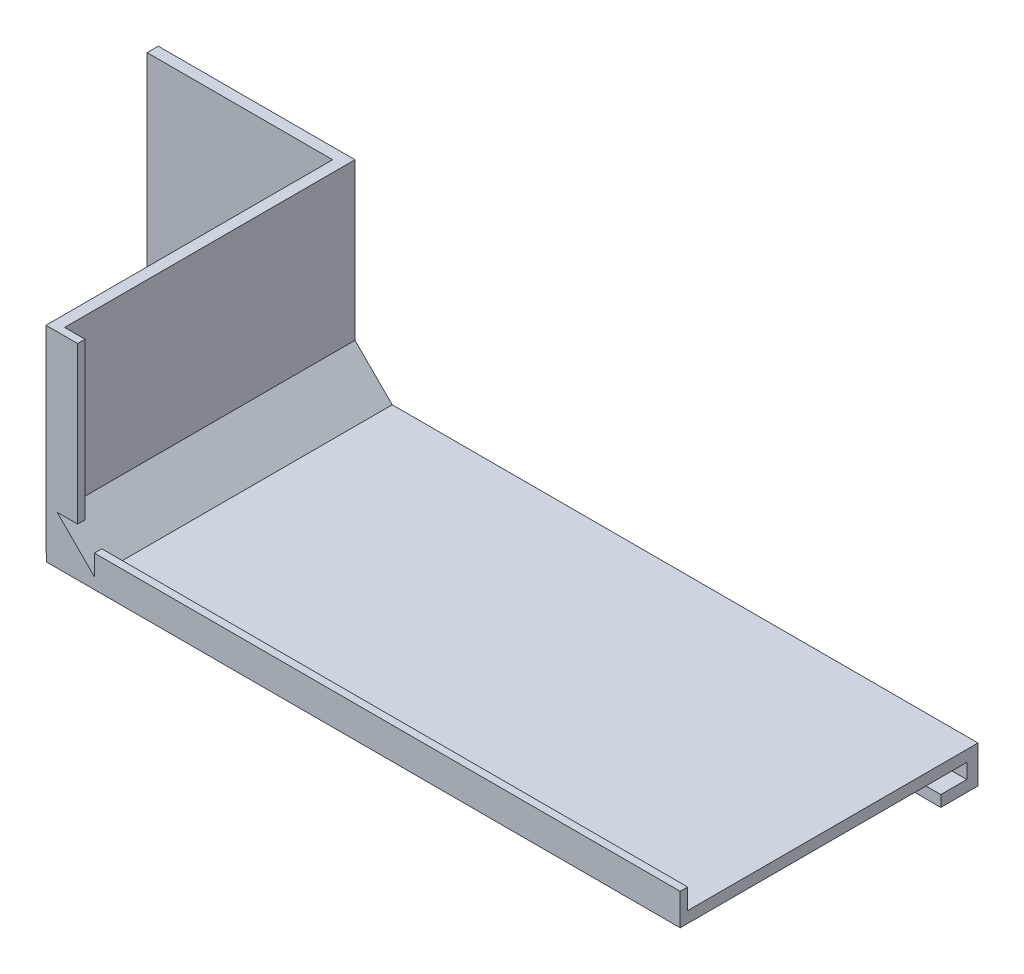
ISO-10303-21;
HEADER;
FILE_DESCRIPTION(('STEP AP214'),'2;1');
FILE_NAME('part.step','',(''),(''),'','','');
FILE_SCHEMA(('AUTOMOTIVE_DESIGN { 1 0 10303 214 1 1 1 1 }'));
ENDSEC;
DATA;
#1=APPLICATION_CONTEXT('core data for automotive mechanical design processes');
#2=APPLICATION_PROTOCOL_DEFINITION('international standard','automotive_design',2000,#1);
#3=PRODUCT_CONTEXT('',#1,'mechanical');
#4=PRODUCT('Part','Part','',(#3));
#5=PRODUCT_RELATED_PRODUCT_CATEGORY('part','',(#4));
#6=PRODUCT_DEFINITION_FORMATION('','',#4);
#7=PRODUCT_DEFINITION_CONTEXT('part definition',#1,'design');
#8=PRODUCT_DEFINITION('design','',#6,#7);
#9=PRODUCT_DEFINITION_SHAPE('','',#8);
#10=(LENGTH_UNIT() NAMED_UNIT(*) SI_UNIT(.MILLI.,.METRE.));
#11=(NAMED_UNIT(*) PLANE_ANGLE_UNIT() SI_UNIT($,.RADIAN.));
#12=(NAMED_UNIT(*) SI_UNIT($,.STERADIAN.) SOLID_ANGLE_UNIT());
#13=UNCERTAINTY_MEASURE_WITH_UNIT(LENGTH_MEASURE(1.E-05),#10,'distance_accuracy_value','');
#14=(GEOMETRIC_REPRESENTATION_CONTEXT(3) GLOBAL_UNCERTAINTY_ASSIGNED_CONTEXT((#13)) GLOBAL_UNIT_ASSIGNED_CONTEXT((#10,
#11,#12)) REPRESENTATION_CONTEXT('',''));
#15=CARTESIAN_POINT('',(0.,0.,0.));
#16=DIRECTION('',(0.,0.,1.));
#17=DIRECTION('',(1.,0.,0.));
#18=AXIS2_PLACEMENT_3D('',#15,#16,#17);
#19=CARTESIAN_POINT('',(0.,4.,0.));
#20=DIRECTION('',(0.,-1.,0.));
#21=DIRECTION('',(0.,0.,-1.));
#22=AXIS2_PLACEMENT_3D('',#19,#20,#21);
#23=PLANE('',#22);
#24=DIRECTION('',(-1.,0.,0.));
#25=VECTOR('',#24,1.);
#26=CARTESIAN_POINT('',(0.,4.,-53.));
#27=LINE('',#26,#25);
#28=CARTESIAN_POINT('',(220.183732216023,4.,-53.));
#29=VERTEX_POINT('',#28);
#30=CARTESIAN_POINT('',(62.8397431775084,4.,-53.));
#31=VERTEX_POINT('',#30);
#32=EDGE_CURVE('E64',#29,#31,#27,.T.);
#33=ORIENTED_EDGE('',*,*,#32,.F.);
#34=DIRECTION('',(0.,0.,1.));
#35=VECTOR('',#34,1.);
#36=CARTESIAN_POINT('',(220.183732216023,4.,-9.99999999999999));
#37=LINE('',#36,#35);
#38=CARTESIAN_POINT('',(220.183732216023,4.,-131.));
#39=VERTEX_POINT('',#38);
#40=EDGE_CURVE('E333',#39,#29,#37,.T.);
#41=ORIENTED_EDGE('',*,*,#40,.F.);
#42=DIRECTION('',(1.,0.,0.));
#43=VECTOR('',#42,1.);
#44=CARTESIAN_POINT('',(39.7994974842648,4.,-131.));
#45=LINE('',#44,#43);
#46=CARTESIAN_POINT('',(62.8397431775084,4.,-131.));
#47=VERTEX_POINT('',#46);
#48=EDGE_CURVE('E329',#47,#39,#45,.T.);
#49=ORIENTED_EDGE('',*,*,#48,.F.);
#50=DIRECTION('',(0.,0.,1.));
#51=VECTOR('',#50,1.);
#52=CARTESIAN_POINT('',(62.8397431775084,4.,-11.5));
#53=LINE('',#52,#51);
#54=EDGE_CURVE('E340',#47,#31,#53,.T.);
#55=ORIENTED_EDGE('',*,*,#54,.T.);
#56=EDGE_LOOP('',(#33,#41,#49,#55));
#57=FACE_BOUND('',#56,.T.);
#58=ADVANCED_FACE('F48',(#57),#23,.F.);
#59=CARTESIAN_POINT('',(52.8397431775085,341.294854205715,134.));
#60=DIRECTION('',(-1.,0.,0.));
#61=DIRECTION('',(0.,0.,1.));
#62=AXIS2_PLACEMENT_3D('',#59,#60,#61);
#63=PLANE('',#62);
#64=DIRECTION('',(0.,1.,0.));
#65=VECTOR('',#64,1.);
#66=CARTESIAN_POINT('',(52.8397431775085,341.294854205715,-53.));
#67=LINE('',#66,#65);
#68=CARTESIAN_POINT('',(52.8397431775085,14.0000000000001,-53.));
#69=VERTEX_POINT('',#68);
#70=CARTESIAN_POINT('',(52.8397431775085,56.,-53.));
#71=VERTEX_POINT('',#70);
#72=EDGE_CURVE('E257',#69,#71,#67,.T.);
#73=ORIENTED_EDGE('',*,*,#72,.F.);
#74=DIRECTION('',(0.,0.,-1.));
#75=VECTOR('',#74,1.);
#76=CARTESIAN_POINT('',(52.8397431775085,14.0000000000001,-131.));
#77=LINE('',#76,#75);
#78=CARTESIAN_POINT('',(52.8397431775085,14.0000000000001,-131.));
#79=VERTEX_POINT('',#78);
#80=EDGE_CURVE('E336',#69,#79,#77,.T.);
#81=ORIENTED_EDGE('',*,*,#80,.T.);
#82=DIRECTION('',(0.,-1.,0.));
#83=VECTOR('',#82,1.);
#84=CARTESIAN_POINT('',(52.8397431775085,341.294854205715,-131.));
#85=LINE('',#84,#83);
#86=CARTESIAN_POINT('',(52.8397431775085,56.,-131.));
#87=VERTEX_POINT('',#86);
#88=EDGE_CURVE('E323',#87,#79,#85,.T.);
#89=ORIENTED_EDGE('',*,*,#88,.F.);
#90=DIRECTION('',(0.,0.,1.));
#91=VECTOR('',#90,1.);
#92=CARTESIAN_POINT('',(52.8397431775085,56.,134.));
#93=LINE('',#92,#91);
#94=EDGE_CURVE('E312',#87,#71,#93,.T.);
#95=ORIENTED_EDGE('',*,*,#94,.T.);
#96=EDGE_LOOP('',(#73,#81,#89,#95));
#97=FACE_BOUND('',#96,.T.);
#98=ADVANCED_FACE('F364',(#97),#63,.F.);
#99=CARTESIAN_POINT('',(0.,0.,-131.));
#100=DIRECTION('',(0.,0.,1.));
#101=DIRECTION('',(1.,0.,0.));
#102=AXIS2_PLACEMENT_3D('',#99,#100,#101);
#103=CYLINDRICAL_SURFACE('',#102,50.);
#104=CARTESIAN_POINT('',(0.,0.,-128.));
#105=DIRECTION('',(0.,0.,-1.));
#106=DIRECTION('',(-1.,0.,0.));
#107=AXIS2_PLACEMENT_3D('',#104,#105,#106);
#108=CIRCLE('',#107,50.);
#109=CARTESIAN_POINT('',(49.6386945839634,-6.,-128.));
#110=VERTEX_POINT('',#109);
#111=CARTESIAN_POINT('',(49.9099188538711,-3.,-128.));
#112=VERTEX_POINT('',#111);
#113=EDGE_CURVE('E194',#110,#112,#108,.F.);
#114=ORIENTED_EDGE('',*,*,#113,.F.);
#115=DIRECTION('',(0.,0.,1.));
#116=VECTOR('',#115,1.);
#117=CARTESIAN_POINT('',(49.6386945839634,-6.,-131.));
#118=LINE('',#117,#116);
#119=CARTESIAN_POINT('',(49.6386945839634,-6.00000000000001,-121.));
#120=VERTEX_POINT('',#119);
#121=EDGE_CURVE('E188',#120,#110,#118,.F.);
#122=ORIENTED_EDGE('',*,*,#121,.F.);
#123=CARTESIAN_POINT('',(0.,0.,-121.));
#124=DIRECTION('',(0.,0.,-1.));
#125=DIRECTION('',(1.,0.,0.));
#126=AXIS2_PLACEMENT_3D('',#123,#124,#125);
#127=CIRCLE('',#126,50.);
#128=CARTESIAN_POINT('',(49.9099188538711,-3.,-121.));
#129=VERTEX_POINT('',#128);
#130=EDGE_CURVE('E193',#129,#120,#127,.T.);
#131=ORIENTED_EDGE('',*,*,#130,.F.);
#132=DIRECTION('',(0.,0.,1.));
#133=VECTOR('',#132,1.);
#134=CARTESIAN_POINT('',(49.9099188538711,-3.,-131.));
#135=LINE('',#134,#133);
#136=EDGE_CURVE('E279',#129,#112,#135,.F.);
#137=ORIENTED_EDGE('',*,*,#136,.T.);
#138=EDGE_LOOP('',(#114,#122,#131,#137));
#139=FACE_BOUND('',#138,.T.);
#140=ADVANCED_FACE('F190',(#139),#103,.F.);
#141=DIRECTION('',(0.,0.,1.));
#142=VECTOR('',#141,1.);
#143=CARTESIAN_POINT('',(49.9899989998,1.,-131.));
#144=LINE('',#143,#142);
#145=CARTESIAN_POINT('',(49.9899989998,1.,-128.));
#146=VERTEX_POINT('',#145);
#147=CARTESIAN_POINT('',(49.9899989998,1.,-51.));
#148=VERTEX_POINT('',#147);
#149=EDGE_CURVE('E292',#146,#148,#144,.T.);
#150=ORIENTED_EDGE('',*,*,#149,.T.);
#151=CARTESIAN_POINT('',(0.,0.,-51.));
#152=DIRECTION('',(0.,0.,-1.));
#153=DIRECTION('',(0.,1.,0.));
#154=AXIS2_PLACEMENT_3D('',#151,#152,#153);
#155=CIRCLE('',#154,50.);
#156=CARTESIAN_POINT('',(49.8397431775085,4.,-51.));
#157=VERTEX_POINT('',#156);
#158=EDGE_CURVE('E264',#148,#157,#155,.F.);
#159=ORIENTED_EDGE('',*,*,#158,.T.);
#160=DIRECTION('',(0.,0.,1.));
#161=VECTOR('',#160,1.);
#162=CARTESIAN_POINT('',(49.8397431775085,4.,131.));
#163=LINE('',#162,#161);
#164=CARTESIAN_POINT('',(49.8397431775085,4.,-128.));
#165=VERTEX_POINT('',#164);
#166=EDGE_CURVE('E309',#165,#157,#163,.T.);
#167=ORIENTED_EDGE('',*,*,#166,.F.);
#168=EDGE_CURVE('E307',#146,#165,#108,.F.);
#169=ORIENTED_EDGE('',*,*,#168,.F.);
#170=EDGE_LOOP('',(#150,#159,#167,#169));
#171=FACE_BOUND('',#170,.T.);
#172=ADVANCED_FACE('F399',(#171),#103,.F.);
#173=CARTESIAN_POINT('',(49.8397431775085,341.294854205715,131.));
#174=DIRECTION('',(1.,0.,0.));
#175=DIRECTION('',(0.,0.,-1.));
#176=AXIS2_PLACEMENT_3D('',#173,#174,#175);
#177=PLANE('',#176);
#178=ORIENTED_EDGE('',*,*,#166,.T.);
#179=DIRECTION('',(0.,1.,0.));
#180=VECTOR('',#179,1.);
#181=CARTESIAN_POINT('',(49.8397431775085,341.294854205715,-51.));
#182=LINE('',#181,#180);
#183=CARTESIAN_POINT('',(49.8397431775085,56.,-51.));
#184=VERTEX_POINT('',#183);
#185=EDGE_CURVE('E267',#157,#184,#182,.T.);
#186=ORIENTED_EDGE('',*,*,#185,.T.);
#187=DIRECTION('',(0.,0.,-1.));
#188=VECTOR('',#187,1.);
#189=CARTESIAN_POINT('',(49.8397431775085,56.,131.));
#190=LINE('',#189,#188);
#191=CARTESIAN_POINT('',(49.8397431775085,56.,-128.));
#192=VERTEX_POINT('',#191);
#193=EDGE_CURVE('E315',#184,#192,#190,.T.);
#194=ORIENTED_EDGE('',*,*,#193,.T.);
#195=DIRECTION('',(0.,-1.,0.));
#196=VECTOR('',#195,1.);
#197=CARTESIAN_POINT('',(49.8397431775084,341.294854205715,-128.));
#198=LINE('',#197,#196);
#199=EDGE_CURVE('E313',#192,#165,#198,.T.);
#200=ORIENTED_EDGE('',*,*,#199,.T.);
#201=EDGE_LOOP('',(#178,#186,#194,#200));
#202=FACE_BOUND('',#201,.T.);
#203=ADVANCED_FACE('F391',(#202),#177,.F.);
#204=CARTESIAN_POINT('',(220.183732216023,4.,-9.99999999999999));
#205=DIRECTION('',(1.,0.,0.));
#206=DIRECTION('',(0.,0.,-1.));
#207=AXIS2_PLACEMENT_3D('',#204,#205,#206);
#208=PLANE('',#207);
#209=DIRECTION('',(0.,0.,1.));
#210=VECTOR('',#209,1.);
#211=CARTESIAN_POINT('',(220.183732216023,9.5,-53.));
#212=LINE('',#211,#210);
#213=CARTESIAN_POINT('',(220.183732216023,9.5,-53.));
#214=VERTEX_POINT('',#213);
#215=CARTESIAN_POINT('',(220.183732216023,9.5,-51.));
#216=VERTEX_POINT('',#215);
#217=EDGE_CURVE('E220',#214,#216,#212,.T.);
#218=ORIENTED_EDGE('',*,*,#217,.T.);
#219=DIRECTION('',(0.,1.,0.));
#220=VECTOR('',#219,1.);
#221=CARTESIAN_POINT('',(220.183732216023,84.2150551607094,-51.));
#222=LINE('',#221,#220);
#223=CARTESIAN_POINT('',(220.183732216023,1.,-51.));
#224=VERTEX_POINT('',#223);
#225=EDGE_CURVE('E262',#224,#216,#222,.T.);
#226=ORIENTED_EDGE('',*,*,#225,.F.);
#227=DIRECTION('',(0.,0.,1.));
#228=VECTOR('',#227,1.);
#229=CARTESIAN_POINT('',(220.183732216023,1.,131.));
#230=LINE('',#229,#228);
#231=CARTESIAN_POINT('',(220.183732216023,1.,-128.));
#232=VERTEX_POINT('',#231);
#233=EDGE_CURVE('E285',#232,#224,#230,.T.);
#234=ORIENTED_EDGE('',*,*,#233,.F.);
#235=DIRECTION('',(0.,1.,0.));
#236=VECTOR('',#235,1.);
#237=CARTESIAN_POINT('',(220.183732216023,-5.,-128.));
#238=LINE('',#237,#236);
#239=CARTESIAN_POINT('',(220.183732216023,-3.,-128.));
#240=VERTEX_POINT('',#239);
#241=EDGE_CURVE('E320',#240,#232,#238,.T.);
#242=ORIENTED_EDGE('',*,*,#241,.F.);
#243=DIRECTION('',(0.,0.,1.));
#244=VECTOR('',#243,1.);
#245=CARTESIAN_POINT('',(220.183732216023,-3.,-123.));
#246=LINE('',#245,#244);
#247=CARTESIAN_POINT('',(220.183732216023,-3.,-121.));
#248=VERTEX_POINT('',#247);
#249=EDGE_CURVE('E283',#240,#248,#246,.T.);
#250=ORIENTED_EDGE('',*,*,#249,.T.);
#251=DIRECTION('',(0.,1.,0.));
#252=VECTOR('',#251,1.);
#253=CARTESIAN_POINT('',(220.183732216023,-6.,-121.));
#254=LINE('',#253,#252);
#255=CARTESIAN_POINT('',(220.183732216023,-6.,-121.));
#256=VERTEX_POINT('',#255);
#257=EDGE_CURVE('E209',#256,#248,#254,.T.);
#258=ORIENTED_EDGE('',*,*,#257,.F.);
#259=DIRECTION('',(0.,0.,1.));
#260=VECTOR('',#259,1.);
#261=CARTESIAN_POINT('',(220.183732216023,-6.,-123.));
#262=LINE('',#261,#260);
#263=CARTESIAN_POINT('',(220.183732216023,-6.,-131.));
#264=VERTEX_POINT('',#263);
#265=EDGE_CURVE('E205',#264,#256,#262,.T.);
#266=ORIENTED_EDGE('',*,*,#265,.F.);
#267=DIRECTION('',(0.,-1.,0.));
#268=VECTOR('',#267,1.);
#269=CARTESIAN_POINT('',(220.183732216023,4.,-131.));
#270=LINE('',#269,#268);
#271=EDGE_CURVE('E330',#39,#264,#270,.T.);
#272=ORIENTED_EDGE('',*,*,#271,.F.);
#273=ORIENTED_EDGE('',*,*,#40,.T.);
#274=DIRECTION('',(0.,1.,0.));
#275=VECTOR('',#274,1.);
#276=CARTESIAN_POINT('',(220.183732216023,2.5,-53.));
#277=LINE('',#276,#275);
#278=EDGE_CURVE('E229',#29,#214,#277,.T.);
#279=ORIENTED_EDGE('',*,*,#278,.T.);
#280=EDGE_LOOP('',(#218,#226,#234,#242,#250,#258,#266,#272,#273,#279));
#281=FACE_BOUND('',#280,.T.);
#282=ADVANCED_FACE('F389',(#281),#208,.T.);
#283=CARTESIAN_POINT('',(0.,0.,-131.));
#284=DIRECTION('',(0.,0.,-1.));
#285=DIRECTION('',(-1.,0.,0.));
#286=AXIS2_PLACEMENT_3D('',#283,#284,#285);
#287=PLANE('',#286);
#288=DIRECTION('',(1.,0.,0.));
#289=VECTOR('',#288,1.);
#290=CARTESIAN_POINT('',(-0.001000000000001,-6.,-131.));
#291=LINE('',#290,#289);
#292=CARTESIAN_POINT('',(49.6890581516696,-6.,-131.));
#293=VERTEX_POINT('',#292);
#294=EDGE_CURVE('E274',#293,#264,#291,.T.);
#295=ORIENTED_EDGE('',*,*,#294,.F.);
#296=CARTESIAN_POINT('',(0.,0.,-131.));
#297=DIRECTION('',(0.,0.,-1.));
#298=DIRECTION('',(-1.,0.,0.));
#299=AXIS2_PLACEMENT_3D('',#296,#297,#298);
#300=CIRCLE('',#299,50.05);
#301=CARTESIAN_POINT('',(0.,-50.05,-131.));
#302=VERTEX_POINT('',#301);
#303=EDGE_CURVE('E305',#293,#302,#300,.T.);
#304=ORIENTED_EDGE('',*,*,#303,.T.);
#305=DIRECTION('',(0.,1.,0.));
#306=VECTOR('',#305,1.);
#307=CARTESIAN_POINT('',(0.,74.9278312200649,-131.));
#308=LINE('',#307,#306);
#309=CARTESIAN_POINT('',(0.,56.,-131.));
#310=VERTEX_POINT('',#309);
#311=EDGE_CURVE('E295',#302,#310,#308,.T.);
#312=ORIENTED_EDGE('',*,*,#311,.T.);
#313=DIRECTION('',(1.,0.,0.));
#314=VECTOR('',#313,1.);
#315=CARTESIAN_POINT('',(-52.8397431775085,56.,-131.));
#316=LINE('',#315,#314);
#317=EDGE_CURVE('E310',#310,#87,#316,.T.);
#318=ORIENTED_EDGE('',*,*,#317,.T.);
#319=ORIENTED_EDGE('',*,*,#88,.T.);
#320=DIRECTION('',(-0.707106781186543,0.707106781186552,0.));
#321=VECTOR('',#320,1.);
#322=CARTESIAN_POINT('',(52.8397431775085,14.0000000000001,-131.));
#323=LINE('',#322,#321);
#324=EDGE_CURVE('E342',#79,#47,#323,.F.);
#325=ORIENTED_EDGE('',*,*,#324,.T.);
#326=ORIENTED_EDGE('',*,*,#48,.T.);
#327=ORIENTED_EDGE('',*,*,#271,.T.);
#328=EDGE_LOOP('',(#295,#304,#312,#318,#319,#325,#326,#327));
#329=FACE_BOUND('',#328,.T.);
#330=ADVANCED_FACE('F355',(#329),#287,.T.);
#331=CARTESIAN_POINT('',(220.183732216023,-5.,-128.));
#332=DIRECTION('',(0.,0.,-1.));
#333=DIRECTION('',(-1.,0.,0.));
#334=AXIS2_PLACEMENT_3D('',#331,#332,#333);
#335=PLANE('',#334);
#336=CARTESIAN_POINT('',(0.,0.,-128.));
#337=DIRECTION('',(0.,0.,-1.));
#338=DIRECTION('',(-1.,0.,0.));
#339=AXIS2_PLACEMENT_3D('',#336,#337,#338);
#340=CIRCLE('',#339,50.05);
#341=CARTESIAN_POINT('',(0.,-50.05,-128.));
#342=VERTEX_POINT('',#341);
#343=CARTESIAN_POINT('',(49.6890581516696,-6.,-128.));
#344=VERTEX_POINT('',#343);
#345=EDGE_CURVE('E303',#342,#344,#340,.F.);
#346=ORIENTED_EDGE('',*,*,#345,.T.);
#347=DIRECTION('',(1.,0.,0.));
#348=VECTOR('',#347,1.);
#349=CARTESIAN_POINT('',(-0.001000000000001,-6.,-128.));
#350=LINE('',#349,#348);
#351=EDGE_CURVE('E198',#110,#344,#350,.T.);
#352=ORIENTED_EDGE('',*,*,#351,.F.);
#353=ORIENTED_EDGE('',*,*,#113,.T.);
#354=DIRECTION('',(1.,0.,0.));
#355=VECTOR('',#354,1.);
#356=CARTESIAN_POINT('',(-0.001000000000001,-3.,-128.));
#357=LINE('',#356,#355);
#358=EDGE_CURVE('E281',#112,#240,#357,.T.);
#359=ORIENTED_EDGE('',*,*,#358,.T.);
#360=ORIENTED_EDGE('',*,*,#241,.T.);
#361=DIRECTION('',(1.,0.,0.));
#362=VECTOR('',#361,1.);
#363=CARTESIAN_POINT('',(0.,1.,-128.));
#364=LINE('',#363,#362);
#365=EDGE_CURVE('E289',#146,#232,#364,.T.);
#366=ORIENTED_EDGE('',*,*,#365,.F.);
#367=ORIENTED_EDGE('',*,*,#168,.T.);
#368=ORIENTED_EDGE('',*,*,#199,.F.);
#369=DIRECTION('',(-1.,0.,0.));
#370=VECTOR('',#369,1.);
#371=CARTESIAN_POINT('',(-49.8397431775085,56.,-128.));
#372=LINE('',#371,#370);
#373=CARTESIAN_POINT('',(0.,56.,-128.));
#374=VERTEX_POINT('',#373);
#375=EDGE_CURVE('E317',#192,#374,#372,.T.);
#376=ORIENTED_EDGE('',*,*,#375,.T.);
#377=DIRECTION('',(0.,-1.,0.));
#378=VECTOR('',#377,1.);
#379=CARTESIAN_POINT('',(0.,-5.,-128.));
#380=LINE('',#379,#378);
#381=EDGE_CURVE('E298',#374,#342,#380,.T.);
#382=ORIENTED_EDGE('',*,*,#381,.T.);
#383=EDGE_LOOP('',(#346,#352,#353,#359,#360,#366,#367,#368,#376,#382));
#384=FACE_BOUND('',#383,.T.);
#385=ADVANCED_FACE('F378',(#384),#335,.F.);
#386=CARTESIAN_POINT('',(42.9502503121069,56.,234.437492999377));
#387=DIRECTION('',(0.,-1.,0.));
#388=DIRECTION('',(0.,0.,-1.));
#389=AXIS2_PLACEMENT_3D('',#386,#387,#388);
#390=PLANE('',#389);
#391=DIRECTION('',(1.,0.,0.));
#392=VECTOR('',#391,1.);
#393=CARTESIAN_POINT('',(42.9502503121069,56.,-51.));
#394=LINE('',#393,#392);
#395=CARTESIAN_POINT('',(58.3397431775085,56.,-51.));
#396=VERTEX_POINT('',#395);
#397=EDGE_CURVE('E270',#184,#396,#394,.T.);
#398=ORIENTED_EDGE('',*,*,#397,.T.);
#399=DIRECTION('',(0.,0.,1.));
#400=VECTOR('',#399,1.);
#401=CARTESIAN_POINT('',(58.3397431775085,56.,-53.));
#402=LINE('',#401,#400);
#403=CARTESIAN_POINT('',(58.3397431775085,56.,-53.));
#404=VERTEX_POINT('',#403);
#405=EDGE_CURVE('E254',#404,#396,#402,.T.);
#406=ORIENTED_EDGE('',*,*,#405,.F.);
#407=DIRECTION('',(-1.,0.,0.));
#408=VECTOR('',#407,1.);
#409=CARTESIAN_POINT('',(51.3397431775085,56.,-53.));
#410=LINE('',#409,#408);
#411=EDGE_CURVE('E247',#404,#71,#410,.T.);
#412=ORIENTED_EDGE('',*,*,#411,.T.);
#413=ORIENTED_EDGE('',*,*,#94,.F.);
#414=ORIENTED_EDGE('',*,*,#317,.F.);
#415=DIRECTION('',(0.,0.,1.));
#416=VECTOR('',#415,1.);
#417=CARTESIAN_POINT('',(0.,56.,234.437492999377));
#418=LINE('',#417,#416);
#419=EDGE_CURVE('E300',#310,#374,#418,.T.);
#420=ORIENTED_EDGE('',*,*,#419,.T.);
#421=ORIENTED_EDGE('',*,*,#375,.F.);
#422=ORIENTED_EDGE('',*,*,#193,.F.);
#423=EDGE_LOOP('',(#398,#406,#412,#413,#414,#420,#421,#422));
#424=FACE_BOUND('',#423,.T.);
#425=ADVANCED_FACE('F358',(#424),#390,.F.);
#426=CARTESIAN_POINT('',(52.8397431775085,14.0000000000001,134.));
#427=DIRECTION('',(0.707106781186552,0.707106781186543,0.));
#428=DIRECTION('',(0.,0.,1.));
#429=AXIS2_PLACEMENT_3D('',#426,#427,#428);
#430=PLANE('',#429);
#431=CARTESIAN_POINT('',(52.8397431775085,14.0000000000001,-51.));
#432=VERTEX_POINT('',#431);
#433=EDGE_CURVE('E337',#432,#69,#77,.T.);
#434=ORIENTED_EDGE('',*,*,#433,.F.);
#435=DIRECTION('',(-0.707106781186543,0.707106781186552,0.));
#436=VECTOR('',#435,1.);
#437=CARTESIAN_POINT('',(52.8397431775085,14.0000000000001,-51.));
#438=LINE('',#437,#436);
#439=CARTESIAN_POINT('',(62.8397432160231,3.9999999614853,-51.));
#440=VERTEX_POINT('',#439);
#441=EDGE_CURVE('E272',#432,#440,#438,.F.);
#442=ORIENTED_EDGE('',*,*,#441,.T.);
#443=DIRECTION('',(0.,0.,1.));
#444=VECTOR('',#443,1.);
#445=CARTESIAN_POINT('',(62.8397432160231,3.99999996148531,134.));
#446=LINE('',#445,#444);
#447=EDGE_CURVE('E72',#440,#31,#446,.F.);
#448=ORIENTED_EDGE('',*,*,#447,.T.);
#449=ORIENTED_EDGE('',*,*,#54,.F.);
#450=ORIENTED_EDGE('',*,*,#324,.F.);
#451=ORIENTED_EDGE('',*,*,#80,.F.);
#452=EDGE_LOOP('',(#434,#442,#448,#449,#450,#451));
#453=FACE_BOUND('',#452,.T.);
#454=ADVANCED_FACE('F51',(#453),#430,.T.);
#455=CARTESIAN_POINT('',(0.,0.,-272.562777593547));
#456=DIRECTION('',(0.,0.,1.));
#457=DIRECTION('',(1.,0.,0.));
#458=AXIS2_PLACEMENT_3D('',#455,#456,#457);
#459=CYLINDRICAL_SURFACE('',#458,50.05);
#460=DIRECTION('',(0.,0.,1.));
#461=VECTOR('',#460,1.);
#462=CARTESIAN_POINT('',(0.,-50.05,-272.562777593547));
#463=LINE('',#462,#461);
#464=EDGE_CURVE('E57',#342,#302,#463,.F.);
#465=ORIENTED_EDGE('',*,*,#464,.T.);
#466=ORIENTED_EDGE('',*,*,#303,.F.);
#467=DIRECTION('',(0.,0.,1.));
#468=VECTOR('',#467,1.);
#469=CARTESIAN_POINT('',(49.6890581516696,-6.,-272.562777593547));
#470=LINE('',#469,#468);
#471=EDGE_CURVE('E199',#293,#344,#470,.T.);
#472=ORIENTED_EDGE('',*,*,#471,.T.);
#473=ORIENTED_EDGE('',*,*,#345,.F.);
#474=EDGE_LOOP('',(#465,#466,#472,#473));
#475=FACE_BOUND('',#474,.T.);
#476=ADVANCED_FACE('F347',(#475),#459,.T.);
#477=CARTESIAN_POINT('',(0.,74.9278312200649,-131.));
#478=DIRECTION('',(1.,0.,0.));
#479=DIRECTION('',(0.,0.,-1.));
#480=AXIS2_PLACEMENT_3D('',#477,#478,#479);
#481=PLANE('',#480);
#482=ORIENTED_EDGE('',*,*,#311,.F.);
#483=ORIENTED_EDGE('',*,*,#464,.F.);
#484=ORIENTED_EDGE('',*,*,#381,.F.);
#485=ORIENTED_EDGE('',*,*,#419,.F.);
#486=EDGE_LOOP('',(#482,#483,#484,#485));
#487=FACE_BOUND('',#486,.T.);
#488=ADVANCED_FACE('F351',(#487),#481,.F.);
#489=CARTESIAN_POINT('',(0.,1.,131.));
#490=DIRECTION('',(0.,1.,0.));
#491=DIRECTION('',(0.,0.,1.));
#492=AXIS2_PLACEMENT_3D('',#489,#490,#491);
#493=PLANE('',#492);
#494=ORIENTED_EDGE('',*,*,#233,.T.);
#495=DIRECTION('',(-1.,0.,0.));
#496=VECTOR('',#495,1.);
#497=CARTESIAN_POINT('',(0.,1.,-51.));
#498=LINE('',#497,#496);
#499=EDGE_CURVE('E13',#224,#148,#498,.T.);
#500=ORIENTED_EDGE('',*,*,#499,.T.);
#501=ORIENTED_EDGE('',*,*,#149,.F.);
#502=ORIENTED_EDGE('',*,*,#365,.T.);
#503=EDGE_LOOP('',(#494,#500,#501,#502));
#504=FACE_BOUND('',#503,.T.);
#505=ADVANCED_FACE('F414',(#504),#493,.F.);
#506=CARTESIAN_POINT('',(-0.001000000000001,-3.,-123.));
#507=DIRECTION('',(0.,1.,0.));
#508=DIRECTION('',(0.,0.,1.));
#509=AXIS2_PLACEMENT_3D('',#506,#507,#508);
#510=PLANE('',#509);
#511=ORIENTED_EDGE('',*,*,#136,.F.);
#512=DIRECTION('',(-1.,0.,0.));
#513=VECTOR('',#512,1.);
#514=CARTESIAN_POINT('',(220.183732216023,-3.,-121.));
#515=LINE('',#514,#513);
#516=EDGE_CURVE('E214',#248,#129,#515,.T.);
#517=ORIENTED_EDGE('',*,*,#516,.F.);
#518=ORIENTED_EDGE('',*,*,#249,.F.);
#519=ORIENTED_EDGE('',*,*,#358,.F.);
#520=EDGE_LOOP('',(#511,#517,#518,#519));
#521=FACE_BOUND('',#520,.T.);
#522=ADVANCED_FACE('F425',(#521),#510,.T.);
#523=CARTESIAN_POINT('',(-0.001000000000001,-6.,-123.));
#524=DIRECTION('',(0.,1.,0.));
#525=DIRECTION('',(0.,0.,1.));
#526=AXIS2_PLACEMENT_3D('',#523,#524,#525);
#527=PLANE('',#526);
#528=ORIENTED_EDGE('',*,*,#121,.T.);
#529=ORIENTED_EDGE('',*,*,#351,.T.);
#530=ORIENTED_EDGE('',*,*,#471,.F.);
#531=ORIENTED_EDGE('',*,*,#294,.T.);
#532=ORIENTED_EDGE('',*,*,#265,.T.);
#533=DIRECTION('',(1.,0.,0.));
#534=VECTOR('',#533,1.);
#535=CARTESIAN_POINT('',(49.6386945839634,-6.00000000000001,-121.));
#536=LINE('',#535,#534);
#537=EDGE_CURVE('E202',#120,#256,#536,.T.);
#538=ORIENTED_EDGE('',*,*,#537,.F.);
#539=EDGE_LOOP('',(#528,#529,#530,#531,#532,#538));
#540=FACE_BOUND('',#539,.T.);
#541=ADVANCED_FACE('F203',(#540),#527,.F.);
#542=CARTESIAN_POINT('',(-41.8162677839768,84.2150551607094,-51.));
#543=DIRECTION('',(0.,0.,-1.));
#544=DIRECTION('',(0.,1.,0.));
#545=AXIS2_PLACEMENT_3D('',#542,#543,#544);
#546=PLANE('',#545);
#547=ORIENTED_EDGE('',*,*,#225,.T.);
#548=DIRECTION('',(-1.,0.,0.));
#549=VECTOR('',#548,1.);
#550=CARTESIAN_POINT('',(220.183732216023,9.5,-51.));
#551=LINE('',#550,#549);
#552=CARTESIAN_POINT('',(62.8397432160231,9.49999999999998,-51.));
#553=VERTEX_POINT('',#552);
#554=EDGE_CURVE('E228',#216,#553,#551,.T.);
#555=ORIENTED_EDGE('',*,*,#554,.T.);
#556=DIRECTION('',(0.,-1.,0.));
#557=VECTOR('',#556,1.);
#558=CARTESIAN_POINT('',(62.8397432160231,2.49999999999998,-51.));
#559=LINE('',#558,#557);
#560=EDGE_CURVE('E225',#553,#440,#559,.T.);
#561=ORIENTED_EDGE('',*,*,#560,.T.);
#562=ORIENTED_EDGE('',*,*,#441,.F.);
#563=DIRECTION('',(1.,0.,0.));
#564=VECTOR('',#563,1.);
#565=CARTESIAN_POINT('',(51.3397431775085,14.0000000000001,-51.));
#566=LINE('',#565,#564);
#567=CARTESIAN_POINT('',(58.3397431775085,14.0000000000001,-51.));
#568=VERTEX_POINT('',#567);
#569=EDGE_CURVE('E240',#432,#568,#566,.T.);
#570=ORIENTED_EDGE('',*,*,#569,.T.);
#571=DIRECTION('',(0.,1.,0.));
#572=VECTOR('',#571,1.);
#573=CARTESIAN_POINT('',(58.3397431775085,56.,-51.));
#574=LINE('',#573,#572);
#575=EDGE_CURVE('E244',#568,#396,#574,.T.);
#576=ORIENTED_EDGE('',*,*,#575,.T.);
#577=ORIENTED_EDGE('',*,*,#397,.F.);
#578=ORIENTED_EDGE('',*,*,#185,.F.);
#579=ORIENTED_EDGE('',*,*,#158,.F.);
#580=ORIENTED_EDGE('',*,*,#499,.F.);
#581=EDGE_LOOP('',(#547,#555,#561,#562,#570,#576,#577,#578,#579,#580));
#582=FACE_BOUND('',#581,.T.);
#583=ADVANCED_FACE('F412',(#582),#546,.F.);
#584=CARTESIAN_POINT('',(0.,0.,-53.));
#585=DIRECTION('',(0.,0.,1.));
#586=DIRECTION('',(1.,0.,0.));
#587=AXIS2_PLACEMENT_3D('',#584,#585,#586);
#588=PLANE('',#587);
#589=DIRECTION('',(1.,0.,0.));
#590=VECTOR('',#589,1.);
#591=CARTESIAN_POINT('',(51.3397431775085,14.0000000000001,-53.));
#592=LINE('',#591,#590);
#593=CARTESIAN_POINT('',(58.3397431775085,14.0000000000001,-53.));
#594=VERTEX_POINT('',#593);
#595=EDGE_CURVE('E241',#69,#594,#592,.T.);
#596=ORIENTED_EDGE('',*,*,#595,.F.);
#597=ORIENTED_EDGE('',*,*,#72,.T.);
#598=ORIENTED_EDGE('',*,*,#411,.F.);
#599=DIRECTION('',(0.,1.,0.));
#600=VECTOR('',#599,1.);
#601=CARTESIAN_POINT('',(58.3397431775085,56.,-53.));
#602=LINE('',#601,#600);
#603=EDGE_CURVE('E243',#594,#404,#602,.T.);
#604=ORIENTED_EDGE('',*,*,#603,.F.);
#605=EDGE_LOOP('',(#596,#597,#598,#604));
#606=FACE_BOUND('',#605,.T.);
#607=ADVANCED_FACE('F488',(#606),#588,.F.);
#608=CARTESIAN_POINT('',(51.3397431775085,14.0000000000001,-53.));
#609=DIRECTION('',(0.,-1.,0.));
#610=DIRECTION('',(0.,0.,-1.));
#611=AXIS2_PLACEMENT_3D('',#608,#609,#610);
#612=PLANE('',#611);
#613=ORIENTED_EDGE('',*,*,#433,.T.);
#614=ORIENTED_EDGE('',*,*,#595,.T.);
#615=DIRECTION('',(0.,0.,1.));
#616=VECTOR('',#615,1.);
#617=CARTESIAN_POINT('',(58.3397431775085,14.0000000000001,-53.));
#618=LINE('',#617,#616);
#619=EDGE_CURVE('E250',#594,#568,#618,.T.);
#620=ORIENTED_EDGE('',*,*,#619,.T.);
#621=ORIENTED_EDGE('',*,*,#569,.F.);
#622=EDGE_LOOP('',(#613,#614,#620,#621));
#623=FACE_BOUND('',#622,.T.);
#624=ADVANCED_FACE('F494',(#623),#612,.T.);
#625=CARTESIAN_POINT('',(58.3397431775085,56.,-53.));
#626=DIRECTION('',(1.,0.,0.));
#627=DIRECTION('',(0.,0.,-1.));
#628=AXIS2_PLACEMENT_3D('',#625,#626,#627);
#629=PLANE('',#628);
#630=ORIENTED_EDGE('',*,*,#575,.F.);
#631=ORIENTED_EDGE('',*,*,#619,.F.);
#632=ORIENTED_EDGE('',*,*,#603,.T.);
#633=ORIENTED_EDGE('',*,*,#405,.T.);
#634=EDGE_LOOP('',(#630,#631,#632,#633));
#635=FACE_BOUND('',#634,.T.);
#636=ADVANCED_FACE('F502',(#635),#629,.T.);
#637=CARTESIAN_POINT('',(0.,0.,-53.));
#638=DIRECTION('',(0.,0.,1.));
#639=DIRECTION('',(1.,0.,0.));
#640=AXIS2_PLACEMENT_3D('',#637,#638,#639);
#641=PLANE('',#640);
#642=ORIENTED_EDGE('',*,*,#278,.F.);
#643=ORIENTED_EDGE('',*,*,#32,.T.);
#644=DIRECTION('',(0.,-1.,0.));
#645=VECTOR('',#644,1.);
#646=CARTESIAN_POINT('',(62.8397432160231,2.49999999999998,-53.));
#647=LINE('',#646,#645);
#648=CARTESIAN_POINT('',(62.8397432160231,9.49999999999998,-53.));
#649=VERTEX_POINT('',#648);
#650=EDGE_CURVE('E223',#649,#31,#647,.T.);
#651=ORIENTED_EDGE('',*,*,#650,.F.);
#652=DIRECTION('',(-1.,0.,0.));
#653=VECTOR('',#652,1.);
#654=CARTESIAN_POINT('',(220.183732216023,9.5,-53.));
#655=LINE('',#654,#653);
#656=EDGE_CURVE('E234',#214,#649,#655,.T.);
#657=ORIENTED_EDGE('',*,*,#656,.F.);
#658=EDGE_LOOP('',(#642,#643,#651,#657));
#659=FACE_BOUND('',#658,.T.);
#660=ADVANCED_FACE('F510',(#659),#641,.F.);
#661=CARTESIAN_POINT('',(62.8397432160231,2.49999999999998,-53.));
#662=DIRECTION('',(-1.,0.,0.));
#663=DIRECTION('',(0.,0.,1.));
#664=AXIS2_PLACEMENT_3D('',#661,#662,#663);
#665=PLANE('',#664);
#666=ORIENTED_EDGE('',*,*,#447,.F.);
#667=ORIENTED_EDGE('',*,*,#560,.F.);
#668=DIRECTION('',(0.,0.,1.));
#669=VECTOR('',#668,1.);
#670=CARTESIAN_POINT('',(62.8397432160231,9.49999999999998,-53.));
#671=LINE('',#670,#669);
#672=EDGE_CURVE('E219',#649,#553,#671,.T.);
#673=ORIENTED_EDGE('',*,*,#672,.F.);
#674=ORIENTED_EDGE('',*,*,#650,.T.);
#675=EDGE_LOOP('',(#666,#667,#673,#674));
#676=FACE_BOUND('',#675,.T.);
#677=ADVANCED_FACE('F518',(#676),#665,.T.);
#678=CARTESIAN_POINT('',(220.183732216023,9.5,-53.));
#679=DIRECTION('',(0.,1.,0.));
#680=DIRECTION('',(-1.,0.,0.));
#681=AXIS2_PLACEMENT_3D('',#678,#679,#680);
#682=PLANE('',#681);
#683=ORIENTED_EDGE('',*,*,#554,.F.);
#684=ORIENTED_EDGE('',*,*,#217,.F.);
#685=ORIENTED_EDGE('',*,*,#656,.T.);
#686=ORIENTED_EDGE('',*,*,#672,.T.);
#687=EDGE_LOOP('',(#683,#684,#685,#686));
#688=FACE_BOUND('',#687,.T.);
#689=ADVANCED_FACE('F409',(#688),#682,.T.);
#690=CARTESIAN_POINT('',(0.,0.,-121.));
#691=DIRECTION('',(0.,0.,1.));
#692=DIRECTION('',(1.,0.,0.));
#693=AXIS2_PLACEMENT_3D('',#690,#691,#692);
#694=PLANE('',#693);
#695=ORIENTED_EDGE('',*,*,#130,.T.);
#696=ORIENTED_EDGE('',*,*,#537,.T.);
#697=ORIENTED_EDGE('',*,*,#257,.T.);
#698=ORIENTED_EDGE('',*,*,#516,.T.);
#699=EDGE_LOOP('',(#695,#696,#697,#698));
#700=FACE_BOUND('',#699,.T.);
#701=ADVANCED_FACE('F212',(#700),#694,.T.);
#702=CLOSED_SHELL('',(#58,#98,#140,#172,#203,#282,#330,#385,#425,#454,#476,#488,#505,#522,#541,
#583,#607,#624,#636,#660,#677,#689,#701));
#703=MANIFOLD_SOLID_BREP('B2',#702);
#704=ADVANCED_BREP_SHAPE_REPRESENTATION('',(#18,#703),#14);
#705=SHAPE_DEFINITION_REPRESENTATION(#9,#704);
ENDSEC;
END-ISO-10303-21;
